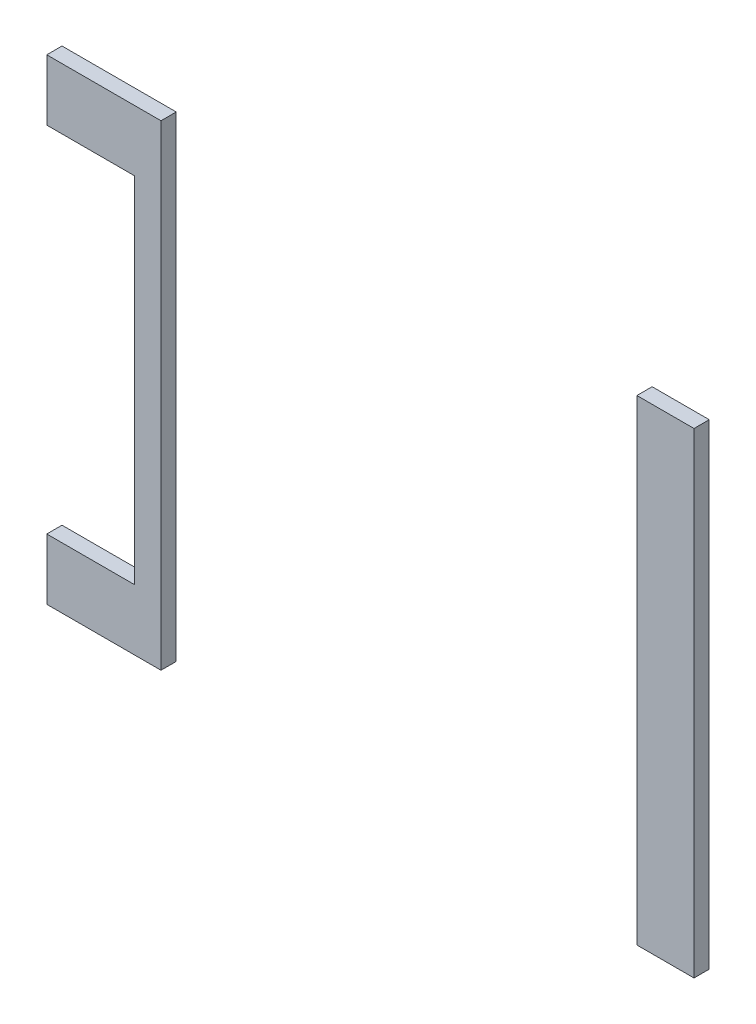
ISO-10303-21;
HEADER;
FILE_DESCRIPTION(('STEP AP214'),'2;1');
FILE_NAME('part.step','',(''),(''),'','','');
FILE_SCHEMA(('AUTOMOTIVE_DESIGN { 1 0 10303 214 1 1 1 1 }'));
ENDSEC;
DATA;
#1=APPLICATION_CONTEXT('core data for automotive mechanical design processes');
#2=APPLICATION_PROTOCOL_DEFINITION('international standard','automotive_design',2000,#1);
#3=PRODUCT_CONTEXT('',#1,'mechanical');
#4=PRODUCT('Part','Part','',(#3));
#5=PRODUCT_RELATED_PRODUCT_CATEGORY('part','',(#4));
#6=PRODUCT_DEFINITION_FORMATION('','',#4);
#7=PRODUCT_DEFINITION_CONTEXT('part definition',#1,'design');
#8=PRODUCT_DEFINITION('design','',#6,#7);
#9=PRODUCT_DEFINITION_SHAPE('','',#8);
#10=(LENGTH_UNIT() NAMED_UNIT(*) SI_UNIT(.MILLI.,.METRE.));
#11=(NAMED_UNIT(*) PLANE_ANGLE_UNIT() SI_UNIT($,.RADIAN.));
#12=(NAMED_UNIT(*) SI_UNIT($,.STERADIAN.) SOLID_ANGLE_UNIT());
#13=UNCERTAINTY_MEASURE_WITH_UNIT(LENGTH_MEASURE(1.E-05),#10,'distance_accuracy_value','');
#14=(GEOMETRIC_REPRESENTATION_CONTEXT(3) GLOBAL_UNCERTAINTY_ASSIGNED_CONTEXT((#13)) GLOBAL_UNIT_ASSIGNED_CONTEXT((#10,
#11,#12)) REPRESENTATION_CONTEXT('',''));
#15=CARTESIAN_POINT('',(0.,0.,0.));
#16=DIRECTION('',(0.,0.,1.));
#17=DIRECTION('',(1.,0.,0.));
#18=AXIS2_PLACEMENT_3D('',#15,#16,#17);
#19=CARTESIAN_POINT('',(0.,0.,0.26));
#20=DIRECTION('',(0.,0.,1.));
#21=DIRECTION('',(1.,0.,0.));
#22=AXIS2_PLACEMENT_3D('',#19,#20,#21);
#23=PLANE('',#22);
#24=DIRECTION('',(-1.,0.,0.));
#25=VECTOR('',#24,1.);
#26=CARTESIAN_POINT('',(-0.65,0.625,0.26));
#27=LINE('',#26,#25);
#28=CARTESIAN_POINT('',(-0.65,0.625,0.26));
#29=VERTEX_POINT('',#28);
#30=CARTESIAN_POINT('',(-0.95,0.625,0.26));
#31=VERTEX_POINT('',#30);
#32=EDGE_CURVE('P0_E152',#29,#31,#27,.T.);
#33=ORIENTED_EDGE('',*,*,#32,.F.);
#34=DIRECTION('',(0.,1.,0.));
#35=VECTOR('',#34,1.);
#36=CARTESIAN_POINT('',(-0.65,-0.625,0.26));
#37=LINE('',#36,#35);
#38=CARTESIAN_POINT('',(-0.65,-0.625,0.26));
#39=VERTEX_POINT('',#38);
#40=EDGE_CURVE('P0_E20',#39,#29,#37,.T.);
#41=ORIENTED_EDGE('',*,*,#40,.F.);
#42=DIRECTION('',(1.,0.,0.));
#43=VECTOR('',#42,1.);
#44=CARTESIAN_POINT('',(-0.95,-0.625,0.26));
#45=LINE('',#44,#43);
#46=CARTESIAN_POINT('',(-0.95,-0.625,0.26));
#47=VERTEX_POINT('',#46);
#48=EDGE_CURVE('P0_E105',#47,#39,#45,.T.);
#49=ORIENTED_EDGE('',*,*,#48,.F.);
#50=DIRECTION('',(0.,-1.,0.));
#51=VECTOR('',#50,1.);
#52=CARTESIAN_POINT('',(-0.95,-0.465,0.26));
#53=LINE('',#52,#51);
#54=CARTESIAN_POINT('',(-0.95,-0.465,0.26));
#55=VERTEX_POINT('',#54);
#56=EDGE_CURVE('P0_E109',#55,#47,#53,.T.);
#57=ORIENTED_EDGE('',*,*,#56,.F.);
#58=DIRECTION('',(-1.,0.,0.));
#59=VECTOR('',#58,1.);
#60=CARTESIAN_POINT('',(-0.72,-0.465,0.26));
#61=LINE('',#60,#59);
#62=CARTESIAN_POINT('',(-0.72,-0.465,0.26));
#63=VERTEX_POINT('',#62);
#64=EDGE_CURVE('P0_E176',#63,#55,#61,.T.);
#65=ORIENTED_EDGE('',*,*,#64,.F.);
#66=DIRECTION('',(0.,-1.,0.));
#67=VECTOR('',#66,1.);
#68=CARTESIAN_POINT('',(-0.72,0.465,0.26));
#69=LINE('',#68,#67);
#70=CARTESIAN_POINT('',(-0.72,0.465,0.26));
#71=VERTEX_POINT('',#70);
#72=EDGE_CURVE('P0_E171',#71,#63,#69,.T.);
#73=ORIENTED_EDGE('',*,*,#72,.F.);
#74=DIRECTION('',(1.,0.,0.));
#75=VECTOR('',#74,1.);
#76=CARTESIAN_POINT('',(-0.95,0.465,0.26));
#77=LINE('',#76,#75);
#78=CARTESIAN_POINT('',(-0.95,0.465,0.26));
#79=VERTEX_POINT('',#78);
#80=EDGE_CURVE('P0_E189',#79,#71,#77,.T.);
#81=ORIENTED_EDGE('',*,*,#80,.F.);
#82=DIRECTION('',(0.,-1.,0.));
#83=VECTOR('',#82,1.);
#84=CARTESIAN_POINT('',(-0.95,0.625,0.26));
#85=LINE('',#84,#83);
#86=EDGE_CURVE('P0_E156',#31,#79,#85,.T.);
#87=ORIENTED_EDGE('',*,*,#86,.F.);
#88=EDGE_LOOP('',(#33,#41,#49,#57,#65,#73,#81,#87));
#89=FACE_BOUND('',#88,.T.);
#90=ADVANCED_FACE('P0_F17',(#89),#23,.F.);
#91=CARTESIAN_POINT('',(0.,0.,0.3));
#92=DIRECTION('',(0.,0.,1.));
#93=DIRECTION('',(1.,0.,0.));
#94=AXIS2_PLACEMENT_3D('',#91,#92,#93);
#95=PLANE('',#94);
#96=DIRECTION('',(-1.,0.,0.));
#97=VECTOR('',#96,1.);
#98=CARTESIAN_POINT('',(-0.65,0.625,0.3));
#99=LINE('',#98,#97);
#100=CARTESIAN_POINT('',(-0.65,0.625,0.3));
#101=VERTEX_POINT('',#100);
#102=CARTESIAN_POINT('',(-0.95,0.625,0.3));
#103=VERTEX_POINT('',#102);
#104=EDGE_CURVE('P0_E154',#101,#103,#99,.T.);
#105=ORIENTED_EDGE('',*,*,#104,.T.);
#106=DIRECTION('',(0.,-1.,0.));
#107=VECTOR('',#106,1.);
#108=CARTESIAN_POINT('',(-0.95,0.625,0.3));
#109=LINE('',#108,#107);
#110=CARTESIAN_POINT('',(-0.95,0.465,0.3));
#111=VERTEX_POINT('',#110);
#112=EDGE_CURVE('P0_E185',#103,#111,#109,.T.);
#113=ORIENTED_EDGE('',*,*,#112,.T.);
#114=DIRECTION('',(1.,0.,0.));
#115=VECTOR('',#114,1.);
#116=CARTESIAN_POINT('',(-0.95,0.465,0.3));
#117=LINE('',#116,#115);
#118=CARTESIAN_POINT('',(-0.72,0.465,0.3));
#119=VERTEX_POINT('',#118);
#120=EDGE_CURVE('P0_E168',#111,#119,#117,.T.);
#121=ORIENTED_EDGE('',*,*,#120,.T.);
#122=DIRECTION('',(0.,-1.,0.));
#123=VECTOR('',#122,1.);
#124=CARTESIAN_POINT('',(-0.72,0.465,0.3));
#125=LINE('',#124,#123);
#126=CARTESIAN_POINT('',(-0.72,-0.465,0.3));
#127=VERTEX_POINT('',#126);
#128=EDGE_CURVE('P0_E200',#119,#127,#125,.T.);
#129=ORIENTED_EDGE('',*,*,#128,.T.);
#130=DIRECTION('',(-1.,0.,0.));
#131=VECTOR('',#130,1.);
#132=CARTESIAN_POINT('',(-0.72,-0.465,0.3));
#133=LINE('',#132,#131);
#134=CARTESIAN_POINT('',(-0.95,-0.465,0.3));
#135=VERTEX_POINT('',#134);
#136=EDGE_CURVE('P0_E125',#127,#135,#133,.T.);
#137=ORIENTED_EDGE('',*,*,#136,.T.);
#138=DIRECTION('',(0.,-1.,0.));
#139=VECTOR('',#138,1.);
#140=CARTESIAN_POINT('',(-0.95,-0.465,0.3));
#141=LINE('',#140,#139);
#142=CARTESIAN_POINT('',(-0.95,-0.625,0.3));
#143=VERTEX_POINT('',#142);
#144=EDGE_CURVE('P0_E97',#135,#143,#141,.T.);
#145=ORIENTED_EDGE('',*,*,#144,.T.);
#146=DIRECTION('',(1.,0.,0.));
#147=VECTOR('',#146,1.);
#148=CARTESIAN_POINT('',(-0.95,-0.625,0.3));
#149=LINE('',#148,#147);
#150=CARTESIAN_POINT('',(-0.65,-0.625,0.3));
#151=VERTEX_POINT('',#150);
#152=EDGE_CURVE('P0_E117',#143,#151,#149,.T.);
#153=ORIENTED_EDGE('',*,*,#152,.T.);
#154=DIRECTION('',(0.,1.,0.));
#155=VECTOR('',#154,1.);
#156=CARTESIAN_POINT('',(-0.65,-0.625,0.3));
#157=LINE('',#156,#155);
#158=EDGE_CURVE('P0_E11',#151,#101,#157,.T.);
#159=ORIENTED_EDGE('',*,*,#158,.T.);
#160=EDGE_LOOP('',(#105,#113,#121,#129,#137,#145,#153,#159));
#161=FACE_BOUND('',#160,.T.);
#162=ADVANCED_FACE('P0_F220',(#161),#95,.T.);
#163=CARTESIAN_POINT('',(-0.65,-0.625,0.3));
#164=DIRECTION('',(-1.,0.,0.));
#165=DIRECTION('',(0.,0.,1.));
#166=AXIS2_PLACEMENT_3D('',#163,#164,#165);
#167=PLANE('',#166);
#168=ORIENTED_EDGE('',*,*,#40,.T.);
#169=DIRECTION('',(0.,0.,-1.));
#170=VECTOR('',#169,1.);
#171=CARTESIAN_POINT('',(-0.65,0.625,0.3));
#172=LINE('',#171,#170);
#173=EDGE_CURVE('P0_E146',#101,#29,#172,.T.);
#174=ORIENTED_EDGE('',*,*,#173,.F.);
#175=ORIENTED_EDGE('',*,*,#158,.F.);
#176=DIRECTION('',(0.,0.,-1.));
#177=VECTOR('',#176,1.);
#178=CARTESIAN_POINT('',(-0.65,-0.625,0.3));
#179=LINE('',#178,#177);
#180=EDGE_CURVE('P0_E113',#151,#39,#179,.T.);
#181=ORIENTED_EDGE('',*,*,#180,.T.);
#182=EDGE_LOOP('',(#168,#174,#175,#181));
#183=FACE_BOUND('',#182,.T.);
#184=ADVANCED_FACE('P0_F145',(#183),#167,.F.);
#185=CARTESIAN_POINT('',(-0.95,-0.625,0.3));
#186=DIRECTION('',(0.,1.,0.));
#187=DIRECTION('',(1.,0.,0.));
#188=AXIS2_PLACEMENT_3D('',#185,#186,#187);
#189=PLANE('',#188);
#190=ORIENTED_EDGE('',*,*,#48,.T.);
#191=ORIENTED_EDGE('',*,*,#180,.F.);
#192=ORIENTED_EDGE('',*,*,#152,.F.);
#193=DIRECTION('',(0.,0.,-1.));
#194=VECTOR('',#193,1.);
#195=CARTESIAN_POINT('',(-0.95,-0.625,0.3));
#196=LINE('',#195,#194);
#197=EDGE_CURVE('P0_E115',#143,#47,#196,.T.);
#198=ORIENTED_EDGE('',*,*,#197,.T.);
#199=EDGE_LOOP('',(#190,#191,#192,#198));
#200=FACE_BOUND('',#199,.T.);
#201=ADVANCED_FACE('P0_F116',(#200),#189,.F.);
#202=CARTESIAN_POINT('',(-0.95,-0.465,0.3));
#203=DIRECTION('',(1.,0.,0.));
#204=DIRECTION('',(0.,1.,0.));
#205=AXIS2_PLACEMENT_3D('',#202,#203,#204);
#206=PLANE('',#205);
#207=ORIENTED_EDGE('',*,*,#56,.T.);
#208=ORIENTED_EDGE('',*,*,#197,.F.);
#209=ORIENTED_EDGE('',*,*,#144,.F.);
#210=DIRECTION('',(0.,0.,-1.));
#211=VECTOR('',#210,1.);
#212=CARTESIAN_POINT('',(-0.95,-0.465,0.3));
#213=LINE('',#212,#211);
#214=EDGE_CURVE('P0_E122',#135,#55,#213,.T.);
#215=ORIENTED_EDGE('',*,*,#214,.T.);
#216=EDGE_LOOP('',(#207,#208,#209,#215));
#217=FACE_BOUND('',#216,.T.);
#218=ADVANCED_FACE('P0_F120',(#217),#206,.F.);
#219=CARTESIAN_POINT('',(-0.72,-0.465,0.3));
#220=DIRECTION('',(0.,-1.,0.));
#221=DIRECTION('',(0.,0.,-1.));
#222=AXIS2_PLACEMENT_3D('',#219,#220,#221);
#223=PLANE('',#222);
#224=ORIENTED_EDGE('',*,*,#64,.T.);
#225=ORIENTED_EDGE('',*,*,#214,.F.);
#226=ORIENTED_EDGE('',*,*,#136,.F.);
#227=DIRECTION('',(0.,0.,-1.));
#228=VECTOR('',#227,1.);
#229=CARTESIAN_POINT('',(-0.72,-0.465,0.3));
#230=LINE('',#229,#228);
#231=EDGE_CURVE('P0_E199',#127,#63,#230,.T.);
#232=ORIENTED_EDGE('',*,*,#231,.T.);
#233=EDGE_LOOP('',(#224,#225,#226,#232));
#234=FACE_BOUND('',#233,.T.);
#235=ADVANCED_FACE('P0_F210',(#234),#223,.F.);
#236=CARTESIAN_POINT('',(-0.72,0.465,0.3));
#237=DIRECTION('',(1.,0.,0.));
#238=DIRECTION('',(0.,1.,0.));
#239=AXIS2_PLACEMENT_3D('',#236,#237,#238);
#240=PLANE('',#239);
#241=ORIENTED_EDGE('',*,*,#72,.T.);
#242=ORIENTED_EDGE('',*,*,#231,.F.);
#243=ORIENTED_EDGE('',*,*,#128,.F.);
#244=DIRECTION('',(0.,0.,-1.));
#245=VECTOR('',#244,1.);
#246=CARTESIAN_POINT('',(-0.72,0.465,0.3));
#247=LINE('',#246,#245);
#248=EDGE_CURVE('P0_E172',#119,#71,#247,.T.);
#249=ORIENTED_EDGE('',*,*,#248,.T.);
#250=EDGE_LOOP('',(#241,#242,#243,#249));
#251=FACE_BOUND('',#250,.T.);
#252=ADVANCED_FACE('P0_F214',(#251),#240,.F.);
#253=CARTESIAN_POINT('',(-0.95,0.465,0.3));
#254=DIRECTION('',(0.,1.,0.));
#255=DIRECTION('',(1.,0.,0.));
#256=AXIS2_PLACEMENT_3D('',#253,#254,#255);
#257=PLANE('',#256);
#258=ORIENTED_EDGE('',*,*,#80,.T.);
#259=ORIENTED_EDGE('',*,*,#248,.F.);
#260=ORIENTED_EDGE('',*,*,#120,.F.);
#261=DIRECTION('',(0.,0.,-1.));
#262=VECTOR('',#261,1.);
#263=CARTESIAN_POINT('',(-0.95,0.465,0.3));
#264=LINE('',#263,#262);
#265=EDGE_CURVE('P0_E181',#111,#79,#264,.T.);
#266=ORIENTED_EDGE('',*,*,#265,.T.);
#267=EDGE_LOOP('',(#258,#259,#260,#266));
#268=FACE_BOUND('',#267,.T.);
#269=ADVANCED_FACE('P0_F216',(#268),#257,.F.);
#270=CARTESIAN_POINT('',(-0.95,0.625,0.3));
#271=DIRECTION('',(1.,0.,0.));
#272=DIRECTION('',(0.,1.,0.));
#273=AXIS2_PLACEMENT_3D('',#270,#271,#272);
#274=PLANE('',#273);
#275=ORIENTED_EDGE('',*,*,#86,.T.);
#276=ORIENTED_EDGE('',*,*,#265,.F.);
#277=ORIENTED_EDGE('',*,*,#112,.F.);
#278=DIRECTION('',(0.,0.,-1.));
#279=VECTOR('',#278,1.);
#280=CARTESIAN_POINT('',(-0.95,0.625,0.3));
#281=LINE('',#280,#279);
#282=EDGE_CURVE('P0_E161',#103,#31,#281,.T.);
#283=ORIENTED_EDGE('',*,*,#282,.T.);
#284=EDGE_LOOP('',(#275,#276,#277,#283));
#285=FACE_BOUND('',#284,.T.);
#286=ADVANCED_FACE('P0_F219',(#285),#274,.F.);
#287=CARTESIAN_POINT('',(-0.65,0.625,0.3));
#288=DIRECTION('',(0.,-1.,0.));
#289=DIRECTION('',(0.,0.,-1.));
#290=AXIS2_PLACEMENT_3D('',#287,#288,#289);
#291=PLANE('',#290);
#292=ORIENTED_EDGE('',*,*,#32,.T.);
#293=ORIENTED_EDGE('',*,*,#282,.F.);
#294=ORIENTED_EDGE('',*,*,#104,.F.);
#295=ORIENTED_EDGE('',*,*,#173,.T.);
#296=EDGE_LOOP('',(#292,#293,#294,#295));
#297=FACE_BOUND('',#296,.T.);
#298=ADVANCED_FACE('P0_F150',(#297),#291,.F.);
#299=CLOSED_SHELL('',(#90,#162,#184,#201,#218,#235,#252,#269,#286,#298));
#300=MANIFOLD_SOLID_BREP('P0_B1',#299);
#301=CARTESIAN_POINT('',(0.,0.,0.26));
#302=DIRECTION('',(0.,0.,1.));
#303=DIRECTION('',(1.,0.,0.));
#304=AXIS2_PLACEMENT_3D('',#301,#302,#303);
#305=PLANE('',#304);
#306=DIRECTION('',(-1.,0.,0.));
#307=VECTOR('',#306,1.);
#308=CARTESIAN_POINT('',(0.75,0.625,0.26));
#309=LINE('',#308,#307);
#310=CARTESIAN_POINT('',(0.75,0.625,0.26));
#311=VERTEX_POINT('',#310);
#312=CARTESIAN_POINT('',(0.6,0.625,0.26));
#313=VERTEX_POINT('',#312);
#314=EDGE_CURVE('P1_E70',#311,#313,#309,.T.);
#315=ORIENTED_EDGE('',*,*,#314,.F.);
#316=DIRECTION('',(0.,1.,0.));
#317=VECTOR('',#316,1.);
#318=CARTESIAN_POINT('',(0.75,-0.625,0.26));
#319=LINE('',#318,#317);
#320=CARTESIAN_POINT('',(0.75,-0.625,0.26));
#321=VERTEX_POINT('',#320);
#322=EDGE_CURVE('P1_E25',#321,#311,#319,.T.);
#323=ORIENTED_EDGE('',*,*,#322,.F.);
#324=DIRECTION('',(1.,0.,0.));
#325=VECTOR('',#324,1.);
#326=CARTESIAN_POINT('',(0.6,-0.625,0.26));
#327=LINE('',#326,#325);
#328=CARTESIAN_POINT('',(0.6,-0.625,0.26));
#329=VERTEX_POINT('',#328);
#330=EDGE_CURVE('P1_E72',#329,#321,#327,.T.);
#331=ORIENTED_EDGE('',*,*,#330,.F.);
#332=DIRECTION('',(0.,-1.,0.));
#333=VECTOR('',#332,1.);
#334=CARTESIAN_POINT('',(0.6,0.625,0.26));
#335=LINE('',#334,#333);
#336=EDGE_CURVE('P1_E67',#313,#329,#335,.T.);
#337=ORIENTED_EDGE('',*,*,#336,.F.);
#338=EDGE_LOOP('',(#315,#323,#331,#337));
#339=FACE_BOUND('',#338,.T.);
#340=ADVANCED_FACE('P1_F17',(#339),#305,.F.);
#341=CARTESIAN_POINT('',(0.,0.,0.3));
#342=DIRECTION('',(0.,0.,1.));
#343=DIRECTION('',(1.,0.,0.));
#344=AXIS2_PLACEMENT_3D('',#341,#342,#343);
#345=PLANE('',#344);
#346=DIRECTION('',(-1.,0.,0.));
#347=VECTOR('',#346,1.);
#348=CARTESIAN_POINT('',(0.75,0.625,0.3));
#349=LINE('',#348,#347);
#350=CARTESIAN_POINT('',(0.75,0.625,0.3));
#351=VERTEX_POINT('',#350);
#352=CARTESIAN_POINT('',(0.6,0.625,0.3));
#353=VERTEX_POINT('',#352);
#354=EDGE_CURVE('P1_E89',#351,#353,#349,.T.);
#355=ORIENTED_EDGE('',*,*,#354,.T.);
#356=DIRECTION('',(0.,-1.,0.));
#357=VECTOR('',#356,1.);
#358=CARTESIAN_POINT('',(0.6,0.625,0.3));
#359=LINE('',#358,#357);
#360=CARTESIAN_POINT('',(0.6,-0.625,0.3));
#361=VERTEX_POINT('',#360);
#362=EDGE_CURVE('P1_E84',#353,#361,#359,.T.);
#363=ORIENTED_EDGE('',*,*,#362,.T.);
#364=DIRECTION('',(1.,0.,0.));
#365=VECTOR('',#364,1.);
#366=CARTESIAN_POINT('',(0.6,-0.625,0.3));
#367=LINE('',#366,#365);
#368=CARTESIAN_POINT('',(0.75,-0.625,0.3));
#369=VERTEX_POINT('',#368);
#370=EDGE_CURVE('P1_E108',#361,#369,#367,.T.);
#371=ORIENTED_EDGE('',*,*,#370,.T.);
#372=DIRECTION('',(0.,1.,0.));
#373=VECTOR('',#372,1.);
#374=CARTESIAN_POINT('',(0.75,-0.625,0.3));
#375=LINE('',#374,#373);
#376=EDGE_CURVE('P1_E11',#369,#351,#375,.T.);
#377=ORIENTED_EDGE('',*,*,#376,.T.);
#378=EDGE_LOOP('',(#355,#363,#371,#377));
#379=FACE_BOUND('',#378,.T.);
#380=ADVANCED_FACE('P1_F118',(#379),#345,.T.);
#381=CARTESIAN_POINT('',(0.75,-0.625,0.3));
#382=DIRECTION('',(-1.,0.,0.));
#383=DIRECTION('',(0.,0.,1.));
#384=AXIS2_PLACEMENT_3D('',#381,#382,#383);
#385=PLANE('',#384);
#386=ORIENTED_EDGE('',*,*,#322,.T.);
#387=DIRECTION('',(0.,0.,-1.));
#388=VECTOR('',#387,1.);
#389=CARTESIAN_POINT('',(0.75,0.625,0.3));
#390=LINE('',#389,#388);
#391=EDGE_CURVE('P1_E78',#351,#311,#390,.T.);
#392=ORIENTED_EDGE('',*,*,#391,.F.);
#393=ORIENTED_EDGE('',*,*,#376,.F.);
#394=DIRECTION('',(0.,0.,-1.));
#395=VECTOR('',#394,1.);
#396=CARTESIAN_POINT('',(0.75,-0.625,0.3));
#397=LINE('',#396,#395);
#398=EDGE_CURVE('P1_E111',#369,#321,#397,.T.);
#399=ORIENTED_EDGE('',*,*,#398,.T.);
#400=EDGE_LOOP('',(#386,#392,#393,#399));
#401=FACE_BOUND('',#400,.T.);
#402=ADVANCED_FACE('P1_F121',(#401),#385,.F.);
#403=CARTESIAN_POINT('',(0.6,-0.625,0.3));
#404=DIRECTION('',(0.,1.,0.));
#405=DIRECTION('',(1.,0.,0.));
#406=AXIS2_PLACEMENT_3D('',#403,#404,#405);
#407=PLANE('',#406);
#408=ORIENTED_EDGE('',*,*,#330,.T.);
#409=ORIENTED_EDGE('',*,*,#398,.F.);
#410=ORIENTED_EDGE('',*,*,#370,.F.);
#411=DIRECTION('',(0.,0.,-1.));
#412=VECTOR('',#411,1.);
#413=CARTESIAN_POINT('',(0.6,-0.625,0.3));
#414=LINE('',#413,#412);
#415=EDGE_CURVE('P1_E77',#361,#329,#414,.T.);
#416=ORIENTED_EDGE('',*,*,#415,.T.);
#417=EDGE_LOOP('',(#408,#409,#410,#416));
#418=FACE_BOUND('',#417,.T.);
#419=ADVANCED_FACE('P1_F120',(#418),#407,.F.);
#420=CARTESIAN_POINT('',(0.6,0.625,0.3));
#421=DIRECTION('',(1.,0.,0.));
#422=DIRECTION('',(0.,1.,0.));
#423=AXIS2_PLACEMENT_3D('',#420,#421,#422);
#424=PLANE('',#423);
#425=ORIENTED_EDGE('',*,*,#336,.T.);
#426=ORIENTED_EDGE('',*,*,#415,.F.);
#427=ORIENTED_EDGE('',*,*,#362,.F.);
#428=DIRECTION('',(0.,0.,-1.));
#429=VECTOR('',#428,1.);
#430=CARTESIAN_POINT('',(0.6,0.625,0.3));
#431=LINE('',#430,#429);
#432=EDGE_CURVE('P1_E81',#353,#313,#431,.T.);
#433=ORIENTED_EDGE('',*,*,#432,.T.);
#434=EDGE_LOOP('',(#425,#426,#427,#433));
#435=FACE_BOUND('',#434,.T.);
#436=ADVANCED_FACE('P1_F82',(#435),#424,.F.);
#437=CARTESIAN_POINT('',(0.75,0.625,0.3));
#438=DIRECTION('',(0.,-1.,0.));
#439=DIRECTION('',(0.,0.,-1.));
#440=AXIS2_PLACEMENT_3D('',#437,#438,#439);
#441=PLANE('',#440);
#442=ORIENTED_EDGE('',*,*,#314,.T.);
#443=ORIENTED_EDGE('',*,*,#432,.F.);
#444=ORIENTED_EDGE('',*,*,#354,.F.);
#445=ORIENTED_EDGE('',*,*,#391,.T.);
#446=EDGE_LOOP('',(#442,#443,#444,#445));
#447=FACE_BOUND('',#446,.T.);
#448=ADVANCED_FACE('P1_F92',(#447),#441,.F.);
#449=CLOSED_SHELL('',(#340,#380,#402,#419,#436,#448));
#450=MANIFOLD_SOLID_BREP('P1_B1',#449);
#451=ADVANCED_BREP_SHAPE_REPRESENTATION('',(#18,#300,#450),#14);
#452=SHAPE_DEFINITION_REPRESENTATION(#9,#451);
ENDSEC;
END-ISO-10303-21;
